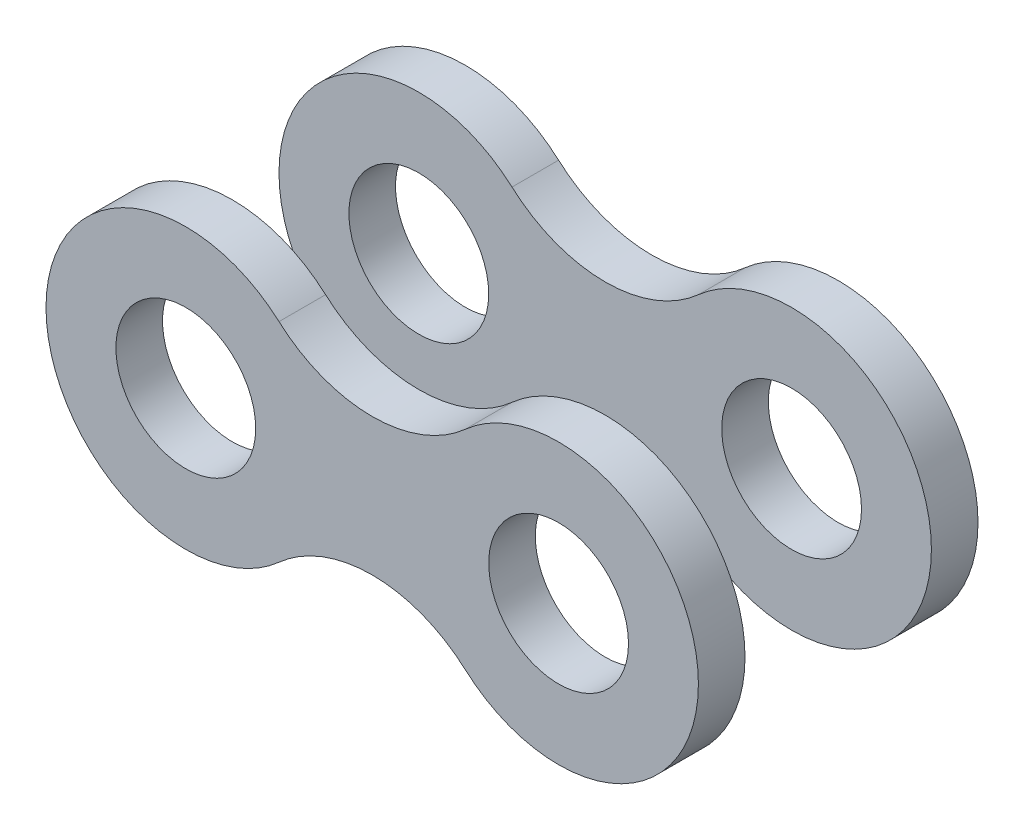
ISO-10303-21;
HEADER;
FILE_DESCRIPTION(('STEP AP214'),'2;1');
FILE_NAME('part.step','',(''),(''),'','','');
FILE_SCHEMA(('AUTOMOTIVE_DESIGN { 1 0 10303 214 1 1 1 1 }'));
ENDSEC;
DATA;
#1=APPLICATION_CONTEXT('core data for automotive mechanical design processes');
#2=APPLICATION_PROTOCOL_DEFINITION('international standard','automotive_design',2000,#1);
#3=PRODUCT_CONTEXT('',#1,'mechanical');
#4=PRODUCT('Part','Part','',(#3));
#5=PRODUCT_RELATED_PRODUCT_CATEGORY('part','',(#4));
#6=PRODUCT_DEFINITION_FORMATION('','',#4);
#7=PRODUCT_DEFINITION_CONTEXT('part definition',#1,'design');
#8=PRODUCT_DEFINITION('design','',#6,#7);
#9=PRODUCT_DEFINITION_SHAPE('','',#8);
#10=(LENGTH_UNIT() NAMED_UNIT(*) SI_UNIT(.MILLI.,.METRE.));
#11=(NAMED_UNIT(*) PLANE_ANGLE_UNIT() SI_UNIT($,.RADIAN.));
#12=(NAMED_UNIT(*) SI_UNIT($,.STERADIAN.) SOLID_ANGLE_UNIT());
#13=UNCERTAINTY_MEASURE_WITH_UNIT(LENGTH_MEASURE(1.E-05),#10,'distance_accuracy_value','');
#14=(GEOMETRIC_REPRESENTATION_CONTEXT(3) GLOBAL_UNCERTAINTY_ASSIGNED_CONTEXT((#13)) GLOBAL_UNIT_ASSIGNED_CONTEXT((#10,
#11,#12)) REPRESENTATION_CONTEXT('',''));
#15=CARTESIAN_POINT('',(0.,0.,0.));
#16=DIRECTION('',(0.,0.,1.));
#17=DIRECTION('',(1.,0.,0.));
#18=AXIS2_PLACEMENT_3D('',#15,#16,#17);
#19=CARTESIAN_POINT('',(0.,0.,3.96875));
#20=DIRECTION('',(0.,0.,1.));
#21=DIRECTION('',(-1.,0.,0.));
#22=AXIS2_PLACEMENT_3D('',#19,#20,#21);
#23=CYLINDRICAL_SURFACE('',#22,2.38125);
#24=CARTESIAN_POINT('',(0.,0.,4.7625));
#25=DIRECTION('',(0.,0.,1.));
#26=DIRECTION('',(1.,0.,0.));
#27=AXIS2_PLACEMENT_3D('',#24,#25,#26);
#28=CIRCLE('',#27,2.38125);
#29=CARTESIAN_POINT('',(1.5875,1.77487895714046,4.7625));
#30=VERTEX_POINT('',#29);
#31=CARTESIAN_POINT('',(1.5875,-1.77487895714046,4.7625));
#32=VERTEX_POINT('',#31);
#33=EDGE_CURVE('E123',#30,#32,#28,.T.);
#34=ORIENTED_EDGE('',*,*,#33,.F.);
#35=DIRECTION('',(0.,0.,1.));
#36=VECTOR('',#35,1.);
#37=CARTESIAN_POINT('',(1.5875,1.77487895714046,3.96875));
#38=LINE('',#37,#36);
#39=CARTESIAN_POINT('',(1.5875,1.77487895714046,3.96875));
#40=VERTEX_POINT('',#39);
#41=EDGE_CURVE('E119',#40,#30,#38,.T.);
#42=ORIENTED_EDGE('',*,*,#41,.F.);
#43=CARTESIAN_POINT('',(0.,0.,3.96875));
#44=DIRECTION('',(0.,0.,1.));
#45=DIRECTION('',(1.,0.,0.));
#46=AXIS2_PLACEMENT_3D('',#43,#44,#45);
#47=CIRCLE('',#46,2.38125);
#48=CARTESIAN_POINT('',(1.5875,-1.77487895714046,3.96875));
#49=VERTEX_POINT('',#48);
#50=EDGE_CURVE('E109',#40,#49,#47,.T.);
#51=ORIENTED_EDGE('',*,*,#50,.T.);
#52=DIRECTION('',(0.,0.,1.));
#53=VECTOR('',#52,1.);
#54=CARTESIAN_POINT('',(1.5875,-1.77487895714046,3.96875));
#55=LINE('',#54,#53);
#56=EDGE_CURVE('E12',#49,#32,#55,.T.);
#57=ORIENTED_EDGE('',*,*,#56,.T.);
#58=EDGE_LOOP('',(#34,#42,#51,#57));
#59=FACE_BOUND('',#58,.T.);
#60=ADVANCED_FACE('F50',(#59),#23,.T.);
#61=CARTESIAN_POINT('',(3.175,-3.54975791428092,3.96875));
#62=DIRECTION('',(0.,0.,1.));
#63=DIRECTION('',(-1.,0.,0.));
#64=AXIS2_PLACEMENT_3D('',#61,#62,#63);
#65=CYLINDRICAL_SURFACE('',#64,2.38125);
#66=CARTESIAN_POINT('',(3.175,-3.54975791428092,4.7625));
#67=DIRECTION('',(0.,0.,1.));
#68=DIRECTION('',(1.,0.,0.));
#69=AXIS2_PLACEMENT_3D('',#66,#67,#68);
#70=CIRCLE('',#69,2.38125);
#71=CARTESIAN_POINT('',(4.7625,-1.77487895714046,4.7625));
#72=VERTEX_POINT('',#71);
#73=EDGE_CURVE('E125',#32,#72,#70,.F.);
#74=ORIENTED_EDGE('',*,*,#73,.F.);
#75=ORIENTED_EDGE('',*,*,#56,.F.);
#76=CARTESIAN_POINT('',(3.175,-3.54975791428092,3.96875));
#77=DIRECTION('',(0.,0.,1.));
#78=DIRECTION('',(1.,0.,0.));
#79=AXIS2_PLACEMENT_3D('',#76,#77,#78);
#80=CIRCLE('',#79,2.38125);
#81=CARTESIAN_POINT('',(4.7625,-1.77487895714046,3.96875));
#82=VERTEX_POINT('',#81);
#83=EDGE_CURVE('E92',#49,#82,#80,.F.);
#84=ORIENTED_EDGE('',*,*,#83,.T.);
#85=DIRECTION('',(0.,0.,1.));
#86=VECTOR('',#85,1.);
#87=CARTESIAN_POINT('',(4.7625,-1.77487895714046,3.96875));
#88=LINE('',#87,#86);
#89=EDGE_CURVE('E59',#82,#72,#88,.T.);
#90=ORIENTED_EDGE('',*,*,#89,.T.);
#91=EDGE_LOOP('',(#74,#75,#84,#90));
#92=FACE_BOUND('',#91,.T.);
#93=ADVANCED_FACE('F107',(#92),#65,.F.);
#94=CARTESIAN_POINT('',(6.35,0.,3.96875));
#95=DIRECTION('',(0.,0.,1.));
#96=DIRECTION('',(-1.,0.,0.));
#97=AXIS2_PLACEMENT_3D('',#94,#95,#96);
#98=CYLINDRICAL_SURFACE('',#97,2.38125);
#99=CARTESIAN_POINT('',(6.35,0.,4.7625));
#100=DIRECTION('',(0.,0.,1.));
#101=DIRECTION('',(1.,0.,0.));
#102=AXIS2_PLACEMENT_3D('',#99,#100,#101);
#103=CIRCLE('',#102,2.38125);
#104=CARTESIAN_POINT('',(4.7625,1.77487895714046,4.7625));
#105=VERTEX_POINT('',#104);
#106=EDGE_CURVE('E103',#72,#105,#103,.T.);
#107=ORIENTED_EDGE('',*,*,#106,.F.);
#108=ORIENTED_EDGE('',*,*,#89,.F.);
#109=CARTESIAN_POINT('',(6.35,0.,3.96875));
#110=DIRECTION('',(0.,0.,1.));
#111=DIRECTION('',(1.,0.,0.));
#112=AXIS2_PLACEMENT_3D('',#109,#110,#111);
#113=CIRCLE('',#112,2.38125);
#114=CARTESIAN_POINT('',(4.7625,1.77487895714046,3.96875));
#115=VERTEX_POINT('',#114);
#116=EDGE_CURVE('E95',#82,#115,#113,.T.);
#117=ORIENTED_EDGE('',*,*,#116,.T.);
#118=DIRECTION('',(0.,0.,1.));
#119=VECTOR('',#118,1.);
#120=CARTESIAN_POINT('',(4.7625,1.77487895714046,3.96875));
#121=LINE('',#120,#119);
#122=EDGE_CURVE('E106',#115,#105,#121,.T.);
#123=ORIENTED_EDGE('',*,*,#122,.T.);
#124=EDGE_LOOP('',(#107,#108,#117,#123));
#125=FACE_BOUND('',#124,.T.);
#126=ADVANCED_FACE('F102',(#125),#98,.T.);
#127=CARTESIAN_POINT('',(3.175,3.54975791428092,3.96875));
#128=DIRECTION('',(0.,0.,1.));
#129=DIRECTION('',(-1.,0.,0.));
#130=AXIS2_PLACEMENT_3D('',#127,#128,#129);
#131=CYLINDRICAL_SURFACE('',#130,2.38125);
#132=CARTESIAN_POINT('',(3.175,3.54975791428092,4.7625));
#133=DIRECTION('',(0.,0.,1.));
#134=DIRECTION('',(1.,0.,0.));
#135=AXIS2_PLACEMENT_3D('',#132,#133,#134);
#136=CIRCLE('',#135,2.38125);
#137=EDGE_CURVE('E81',#30,#105,#136,.T.);
#138=ORIENTED_EDGE('',*,*,#137,.T.);
#139=ORIENTED_EDGE('',*,*,#122,.F.);
#140=CARTESIAN_POINT('',(3.175,3.54975791428092,3.96875));
#141=DIRECTION('',(0.,0.,1.));
#142=DIRECTION('',(1.,0.,0.));
#143=AXIS2_PLACEMENT_3D('',#140,#141,#142);
#144=CIRCLE('',#143,2.38125);
#145=EDGE_CURVE('E67',#40,#115,#144,.T.);
#146=ORIENTED_EDGE('',*,*,#145,.F.);
#147=ORIENTED_EDGE('',*,*,#41,.T.);
#148=EDGE_LOOP('',(#138,#139,#146,#147));
#149=FACE_BOUND('',#148,.T.);
#150=ADVANCED_FACE('F138',(#149),#131,.F.);
#151=CARTESIAN_POINT('',(0.,0.,3.96875));
#152=DIRECTION('',(0.,0.,1.));
#153=DIRECTION('',(-1.,0.,0.));
#154=AXIS2_PLACEMENT_3D('',#151,#152,#153);
#155=CYLINDRICAL_SURFACE('',#154,1.190625);
#156=CARTESIAN_POINT('',(0.,0.,3.96875));
#157=DIRECTION('',(0.,0.,1.));
#158=DIRECTION('',(1.,0.,0.));
#159=AXIS2_PLACEMENT_3D('',#156,#157,#158);
#160=CIRCLE('',#159,1.190625);
#161=CARTESIAN_POINT('',(1.190625,0.,3.96875));
#162=VERTEX_POINT('',#161);
#163=EDGE_CURVE('E111',#162,#162,#160,.T.);
#164=ORIENTED_EDGE('',*,*,#163,.F.);
#165=EDGE_LOOP('',(#164));
#166=FACE_BOUND('',#165,.T.);
#167=CARTESIAN_POINT('',(0.,0.,4.7625));
#168=DIRECTION('',(0.,0.,1.));
#169=DIRECTION('',(1.,0.,0.));
#170=AXIS2_PLACEMENT_3D('',#167,#168,#169);
#171=CIRCLE('',#170,1.190625);
#172=CARTESIAN_POINT('',(1.190625,0.,4.7625));
#173=VERTEX_POINT('',#172);
#174=EDGE_CURVE('E120',#173,#173,#171,.T.);
#175=ORIENTED_EDGE('',*,*,#174,.T.);
#176=EDGE_LOOP('',(#175));
#177=FACE_BOUND('',#176,.T.);
#178=ADVANCED_FACE('F52',(#166,#177),#155,.F.);
#179=CARTESIAN_POINT('',(6.35,0.,3.96875));
#180=DIRECTION('',(0.,0.,1.));
#181=DIRECTION('',(-1.,0.,0.));
#182=AXIS2_PLACEMENT_3D('',#179,#180,#181);
#183=CYLINDRICAL_SURFACE('',#182,1.190625);
#184=CARTESIAN_POINT('',(6.35,0.,3.96875));
#185=DIRECTION('',(0.,0.,1.));
#186=DIRECTION('',(1.,0.,0.));
#187=AXIS2_PLACEMENT_3D('',#184,#185,#186);
#188=CIRCLE('',#187,1.190625);
#189=CARTESIAN_POINT('',(7.540625,0.,3.96875));
#190=VERTEX_POINT('',#189);
#191=EDGE_CURVE('E116',#190,#190,#188,.T.);
#192=ORIENTED_EDGE('',*,*,#191,.F.);
#193=EDGE_LOOP('',(#192));
#194=FACE_BOUND('',#193,.T.);
#195=CARTESIAN_POINT('',(6.35,0.,4.7625));
#196=DIRECTION('',(0.,0.,1.));
#197=DIRECTION('',(1.,0.,0.));
#198=AXIS2_PLACEMENT_3D('',#195,#196,#197);
#199=CIRCLE('',#198,1.190625);
#200=CARTESIAN_POINT('',(7.540625,0.,4.7625));
#201=VERTEX_POINT('',#200);
#202=EDGE_CURVE('E129',#201,#201,#199,.T.);
#203=ORIENTED_EDGE('',*,*,#202,.T.);
#204=EDGE_LOOP('',(#203));
#205=FACE_BOUND('',#204,.T.);
#206=ADVANCED_FACE('F145',(#194,#205),#183,.F.);
#207=CARTESIAN_POINT('',(0.,0.,3.96875));
#208=DIRECTION('',(0.,0.,-1.));
#209=DIRECTION('',(1.,0.,0.));
#210=AXIS2_PLACEMENT_3D('',#207,#208,#209);
#211=PLANE('',#210);
#212=ORIENTED_EDGE('',*,*,#163,.T.);
#213=EDGE_LOOP('',(#212));
#214=FACE_BOUND('',#213,.T.);
#215=ORIENTED_EDGE('',*,*,#50,.F.);
#216=ORIENTED_EDGE('',*,*,#145,.T.);
#217=ORIENTED_EDGE('',*,*,#116,.F.);
#218=ORIENTED_EDGE('',*,*,#83,.F.);
#219=EDGE_LOOP('',(#215,#216,#217,#218));
#220=FACE_BOUND('',#219,.T.);
#221=ORIENTED_EDGE('',*,*,#191,.T.);
#222=EDGE_LOOP('',(#221));
#223=FACE_BOUND('',#222,.T.);
#224=ADVANCED_FACE('F97',(#214,#220,#223),#211,.T.);
#225=CARTESIAN_POINT('',(0.,0.,4.7625));
#226=DIRECTION('',(0.,0.,-1.));
#227=DIRECTION('',(1.,0.,0.));
#228=AXIS2_PLACEMENT_3D('',#225,#226,#227);
#229=PLANE('',#228);
#230=ORIENTED_EDGE('',*,*,#174,.F.);
#231=EDGE_LOOP('',(#230));
#232=FACE_BOUND('',#231,.T.);
#233=ORIENTED_EDGE('',*,*,#33,.T.);
#234=ORIENTED_EDGE('',*,*,#73,.T.);
#235=ORIENTED_EDGE('',*,*,#106,.T.);
#236=ORIENTED_EDGE('',*,*,#137,.F.);
#237=EDGE_LOOP('',(#233,#234,#235,#236));
#238=FACE_BOUND('',#237,.T.);
#239=ORIENTED_EDGE('',*,*,#202,.F.);
#240=EDGE_LOOP('',(#239));
#241=FACE_BOUND('',#240,.T.);
#242=ADVANCED_FACE('F133',(#232,#238,#241),#229,.F.);
#243=CLOSED_SHELL('',(#60,#93,#126,#150,#178,#206,#224,#242));
#244=MANIFOLD_SOLID_BREP('B2',#243);
#245=CARTESIAN_POINT('',(0.,0.,0.79375));
#246=DIRECTION('',(0.,0.,-1.));
#247=DIRECTION('',(-1.,0.,0.));
#248=AXIS2_PLACEMENT_3D('',#245,#246,#247);
#249=CYLINDRICAL_SURFACE('',#248,2.38125);
#250=CARTESIAN_POINT('',(0.,0.,0.));
#251=DIRECTION('',(0.,0.,1.));
#252=DIRECTION('',(1.,0.,0.));
#253=AXIS2_PLACEMENT_3D('',#250,#251,#252);
#254=CIRCLE('',#253,2.38125);
#255=CARTESIAN_POINT('',(1.5875,1.77487895714046,0.));
#256=VERTEX_POINT('',#255);
#257=CARTESIAN_POINT('',(1.5875,-1.77487895714046,0.));
#258=VERTEX_POINT('',#257);
#259=EDGE_CURVE('E298',#256,#258,#254,.T.);
#260=ORIENTED_EDGE('',*,*,#259,.T.);
#261=DIRECTION('',(0.,0.,-1.));
#262=VECTOR('',#261,1.);
#263=CARTESIAN_POINT('',(1.5875,-1.77487895714046,0.79375));
#264=LINE('',#263,#262);
#265=CARTESIAN_POINT('',(1.5875,-1.77487895714046,0.79375));
#266=VERTEX_POINT('',#265);
#267=EDGE_CURVE('E48',#266,#258,#264,.T.);
#268=ORIENTED_EDGE('',*,*,#267,.F.);
#269=CARTESIAN_POINT('',(0.,0.,0.79375));
#270=DIRECTION('',(0.,0.,1.));
#271=DIRECTION('',(1.,0.,0.));
#272=AXIS2_PLACEMENT_3D('',#269,#270,#271);
#273=CIRCLE('',#272,2.38125);
#274=CARTESIAN_POINT('',(1.5875,1.77487895714046,0.79375));
#275=VERTEX_POINT('',#274);
#276=EDGE_CURVE('E278',#275,#266,#273,.T.);
#277=ORIENTED_EDGE('',*,*,#276,.F.);
#278=DIRECTION('',(0.,0.,-1.));
#279=VECTOR('',#278,1.);
#280=CARTESIAN_POINT('',(1.5875,1.77487895714046,0.79375));
#281=LINE('',#280,#279);
#282=EDGE_CURVE('E244',#275,#256,#281,.T.);
#283=ORIENTED_EDGE('',*,*,#282,.T.);
#284=EDGE_LOOP('',(#260,#268,#277,#283));
#285=FACE_BOUND('',#284,.T.);
#286=ADVANCED_FACE('F227',(#285),#249,.T.);
#287=CARTESIAN_POINT('',(3.175,-3.54975791428092,0.79375));
#288=DIRECTION('',(0.,0.,-1.));
#289=DIRECTION('',(-1.,0.,0.));
#290=AXIS2_PLACEMENT_3D('',#287,#288,#289);
#291=CYLINDRICAL_SURFACE('',#290,2.38125);
#292=CARTESIAN_POINT('',(3.175,-3.54975791428092,0.));
#293=DIRECTION('',(0.,0.,1.));
#294=DIRECTION('',(1.,0.,0.));
#295=AXIS2_PLACEMENT_3D('',#292,#293,#294);
#296=CIRCLE('',#295,2.38125);
#297=CARTESIAN_POINT('',(4.7625,-1.77487895714046,0.));
#298=VERTEX_POINT('',#297);
#299=EDGE_CURVE('E283',#258,#298,#296,.F.);
#300=ORIENTED_EDGE('',*,*,#299,.T.);
#301=DIRECTION('',(0.,0.,-1.));
#302=VECTOR('',#301,1.);
#303=CARTESIAN_POINT('',(4.7625,-1.77487895714046,0.79375));
#304=LINE('',#303,#302);
#305=CARTESIAN_POINT('',(4.7625,-1.77487895714046,0.79375));
#306=VERTEX_POINT('',#305);
#307=EDGE_CURVE('E236',#306,#298,#304,.T.);
#308=ORIENTED_EDGE('',*,*,#307,.F.);
#309=CARTESIAN_POINT('',(3.175,-3.54975791428092,0.79375));
#310=DIRECTION('',(0.,0.,1.));
#311=DIRECTION('',(1.,0.,0.));
#312=AXIS2_PLACEMENT_3D('',#309,#310,#311);
#313=CIRCLE('',#312,2.38125);
#314=EDGE_CURVE('E270',#266,#306,#313,.F.);
#315=ORIENTED_EDGE('',*,*,#314,.F.);
#316=ORIENTED_EDGE('',*,*,#267,.T.);
#317=EDGE_LOOP('',(#300,#308,#315,#316));
#318=FACE_BOUND('',#317,.T.);
#319=ADVANCED_FACE('F282',(#318),#291,.F.);
#320=CARTESIAN_POINT('',(6.35,0.,0.79375));
#321=DIRECTION('',(0.,0.,-1.));
#322=DIRECTION('',(-1.,0.,0.));
#323=AXIS2_PLACEMENT_3D('',#320,#321,#322);
#324=CYLINDRICAL_SURFACE('',#323,2.38125);
#325=CARTESIAN_POINT('',(6.35,0.,0.));
#326=DIRECTION('',(0.,0.,1.));
#327=DIRECTION('',(1.,0.,0.));
#328=AXIS2_PLACEMENT_3D('',#325,#326,#327);
#329=CIRCLE('',#328,2.38125);
#330=CARTESIAN_POINT('',(4.7625,1.77487895714046,0.));
#331=VERTEX_POINT('',#330);
#332=EDGE_CURVE('E301',#298,#331,#329,.T.);
#333=ORIENTED_EDGE('',*,*,#332,.T.);
#334=DIRECTION('',(0.,0.,-1.));
#335=VECTOR('',#334,1.);
#336=CARTESIAN_POINT('',(4.7625,1.77487895714046,0.79375));
#337=LINE('',#336,#335);
#338=CARTESIAN_POINT('',(4.7625,1.77487895714046,0.79375));
#339=VERTEX_POINT('',#338);
#340=EDGE_CURVE('E259',#339,#331,#337,.T.);
#341=ORIENTED_EDGE('',*,*,#340,.F.);
#342=CARTESIAN_POINT('',(6.35,0.,0.79375));
#343=DIRECTION('',(0.,0.,1.));
#344=DIRECTION('',(1.,0.,0.));
#345=AXIS2_PLACEMENT_3D('',#342,#343,#344);
#346=CIRCLE('',#345,2.38125);
#347=EDGE_CURVE('E277',#306,#339,#346,.T.);
#348=ORIENTED_EDGE('',*,*,#347,.F.);
#349=ORIENTED_EDGE('',*,*,#307,.T.);
#350=EDGE_LOOP('',(#333,#341,#348,#349));
#351=FACE_BOUND('',#350,.T.);
#352=ADVANCED_FACE('F286',(#351),#324,.T.);
#353=CARTESIAN_POINT('',(3.175,3.54975791428092,0.79375));
#354=DIRECTION('',(0.,0.,-1.));
#355=DIRECTION('',(-1.,0.,0.));
#356=AXIS2_PLACEMENT_3D('',#353,#354,#355);
#357=CYLINDRICAL_SURFACE('',#356,2.38125);
#358=CARTESIAN_POINT('',(3.175,3.54975791428092,0.));
#359=DIRECTION('',(0.,0.,1.));
#360=DIRECTION('',(1.,0.,0.));
#361=AXIS2_PLACEMENT_3D('',#358,#359,#360);
#362=CIRCLE('',#361,2.38125);
#363=EDGE_CURVE('E303',#256,#331,#362,.T.);
#364=ORIENTED_EDGE('',*,*,#363,.F.);
#365=ORIENTED_EDGE('',*,*,#282,.F.);
#366=CARTESIAN_POINT('',(3.175,3.54975791428092,0.79375));
#367=DIRECTION('',(0.,0.,1.));
#368=DIRECTION('',(1.,0.,0.));
#369=AXIS2_PLACEMENT_3D('',#366,#367,#368);
#370=CIRCLE('',#369,2.38125);
#371=EDGE_CURVE('E287',#275,#339,#370,.T.);
#372=ORIENTED_EDGE('',*,*,#371,.T.);
#373=ORIENTED_EDGE('',*,*,#340,.T.);
#374=EDGE_LOOP('',(#364,#365,#372,#373));
#375=FACE_BOUND('',#374,.T.);
#376=ADVANCED_FACE('F339',(#375),#357,.F.);
#377=CARTESIAN_POINT('',(0.,0.,0.79375));
#378=DIRECTION('',(0.,0.,-1.));
#379=DIRECTION('',(-1.,0.,0.));
#380=AXIS2_PLACEMENT_3D('',#377,#378,#379);
#381=CYLINDRICAL_SURFACE('',#380,1.190625);
#382=CARTESIAN_POINT('',(0.,0.,0.79375));
#383=DIRECTION('',(0.,0.,1.));
#384=DIRECTION('',(1.,0.,0.));
#385=AXIS2_PLACEMENT_3D('',#382,#383,#384);
#386=CIRCLE('',#385,1.190625);
#387=CARTESIAN_POINT('',(1.190625,0.,0.79375));
#388=VERTEX_POINT('',#387);
#389=EDGE_CURVE('E309',#388,#388,#386,.T.);
#390=ORIENTED_EDGE('',*,*,#389,.T.);
#391=EDGE_LOOP('',(#390));
#392=FACE_BOUND('',#391,.T.);
#393=CARTESIAN_POINT('',(0.,0.,0.));
#394=DIRECTION('',(0.,0.,1.));
#395=DIRECTION('',(1.,0.,0.));
#396=AXIS2_PLACEMENT_3D('',#393,#394,#395);
#397=CIRCLE('',#396,1.190625);
#398=CARTESIAN_POINT('',(1.190625,0.,0.));
#399=VERTEX_POINT('',#398);
#400=EDGE_CURVE('E295',#399,#399,#397,.T.);
#401=ORIENTED_EDGE('',*,*,#400,.F.);
#402=EDGE_LOOP('',(#401));
#403=FACE_BOUND('',#402,.T.);
#404=ADVANCED_FACE('F229',(#392,#403),#381,.F.);
#405=CARTESIAN_POINT('',(6.35,0.,0.79375));
#406=DIRECTION('',(0.,0.,-1.));
#407=DIRECTION('',(-1.,0.,0.));
#408=AXIS2_PLACEMENT_3D('',#405,#406,#407);
#409=CYLINDRICAL_SURFACE('',#408,1.190625);
#410=CARTESIAN_POINT('',(6.35,0.,0.79375));
#411=DIRECTION('',(0.,0.,1.));
#412=DIRECTION('',(1.,0.,0.));
#413=AXIS2_PLACEMENT_3D('',#410,#411,#412);
#414=CIRCLE('',#413,1.190625);
#415=CARTESIAN_POINT('',(7.540625,0.,0.79375));
#416=VERTEX_POINT('',#415);
#417=EDGE_CURVE('E289',#416,#416,#414,.T.);
#418=ORIENTED_EDGE('',*,*,#417,.T.);
#419=EDGE_LOOP('',(#418));
#420=FACE_BOUND('',#419,.T.);
#421=CARTESIAN_POINT('',(6.35,0.,0.));
#422=DIRECTION('',(0.,0.,1.));
#423=DIRECTION('',(1.,0.,0.));
#424=AXIS2_PLACEMENT_3D('',#421,#422,#423);
#425=CIRCLE('',#424,1.190625);
#426=CARTESIAN_POINT('',(7.540625,0.,0.));
#427=VERTEX_POINT('',#426);
#428=EDGE_CURVE('E306',#427,#427,#425,.T.);
#429=ORIENTED_EDGE('',*,*,#428,.F.);
#430=EDGE_LOOP('',(#429));
#431=FACE_BOUND('',#430,.T.);
#432=ADVANCED_FACE('F321',(#420,#431),#409,.F.);
#433=CARTESIAN_POINT('',(0.,0.,0.79375));
#434=DIRECTION('',(0.,0.,1.));
#435=DIRECTION('',(1.,0.,0.));
#436=AXIS2_PLACEMENT_3D('',#433,#434,#435);
#437=PLANE('',#436);
#438=ORIENTED_EDGE('',*,*,#389,.F.);
#439=EDGE_LOOP('',(#438));
#440=FACE_BOUND('',#439,.T.);
#441=ORIENTED_EDGE('',*,*,#276,.T.);
#442=ORIENTED_EDGE('',*,*,#314,.T.);
#443=ORIENTED_EDGE('',*,*,#347,.T.);
#444=ORIENTED_EDGE('',*,*,#371,.F.);
#445=EDGE_LOOP('',(#441,#442,#443,#444));
#446=FACE_BOUND('',#445,.T.);
#447=ORIENTED_EDGE('',*,*,#417,.F.);
#448=EDGE_LOOP('',(#447));
#449=FACE_BOUND('',#448,.T.);
#450=ADVANCED_FACE('F273',(#440,#446,#449),#437,.T.);
#451=CARTESIAN_POINT('',(0.,0.,0.));
#452=DIRECTION('',(0.,0.,1.));
#453=DIRECTION('',(1.,0.,0.));
#454=AXIS2_PLACEMENT_3D('',#451,#452,#453);
#455=PLANE('',#454);
#456=ORIENTED_EDGE('',*,*,#400,.T.);
#457=EDGE_LOOP('',(#456));
#458=FACE_BOUND('',#457,.T.);
#459=ORIENTED_EDGE('',*,*,#259,.F.);
#460=ORIENTED_EDGE('',*,*,#363,.T.);
#461=ORIENTED_EDGE('',*,*,#332,.F.);
#462=ORIENTED_EDGE('',*,*,#299,.F.);
#463=EDGE_LOOP('',(#459,#460,#461,#462));
#464=FACE_BOUND('',#463,.T.);
#465=ORIENTED_EDGE('',*,*,#428,.T.);
#466=EDGE_LOOP('',(#465));
#467=FACE_BOUND('',#466,.T.);
#468=ADVANCED_FACE('F320',(#458,#464,#467),#455,.F.);
#469=CLOSED_SHELL('',(#286,#319,#352,#376,#404,#432,#450,#468));
#470=MANIFOLD_SOLID_BREP('B6',#469);
#471=ADVANCED_BREP_SHAPE_REPRESENTATION('',(#18,#244,#470),#14);
#472=SHAPE_DEFINITION_REPRESENTATION(#9,#471);
ENDSEC;
END-ISO-10303-21;
